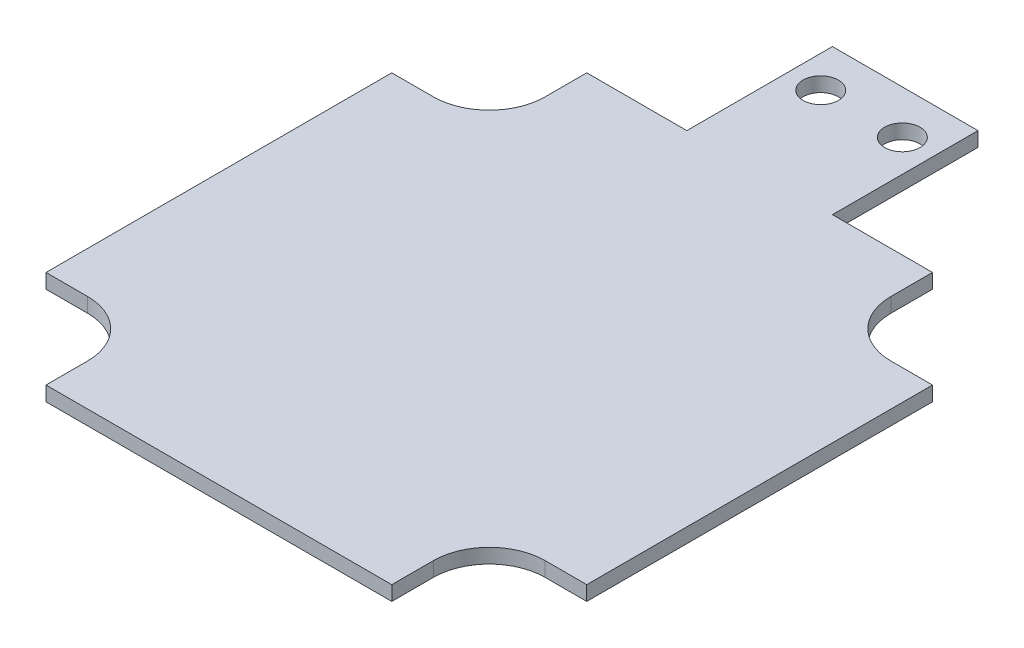
ISO-10303-21;
HEADER;
FILE_DESCRIPTION(('STEP AP214'),'2;1');
FILE_NAME('part.step','',(''),(''),'','','');
FILE_SCHEMA(('AUTOMOTIVE_DESIGN { 1 0 10303 214 1 1 1 1 }'));
ENDSEC;
DATA;
#1=APPLICATION_CONTEXT('core data for automotive mechanical design processes');
#2=APPLICATION_PROTOCOL_DEFINITION('international standard','automotive_design',2000,#1);
#3=PRODUCT_CONTEXT('',#1,'mechanical');
#4=PRODUCT('Part','Part','',(#3));
#5=PRODUCT_RELATED_PRODUCT_CATEGORY('part','',(#4));
#6=PRODUCT_DEFINITION_FORMATION('','',#4);
#7=PRODUCT_DEFINITION_CONTEXT('part definition',#1,'design');
#8=PRODUCT_DEFINITION('design','',#6,#7);
#9=PRODUCT_DEFINITION_SHAPE('','',#8);
#10=(LENGTH_UNIT() NAMED_UNIT(*) SI_UNIT(.MILLI.,.METRE.));
#11=(NAMED_UNIT(*) PLANE_ANGLE_UNIT() SI_UNIT($,.RADIAN.));
#12=(NAMED_UNIT(*) SI_UNIT($,.STERADIAN.) SOLID_ANGLE_UNIT());
#13=UNCERTAINTY_MEASURE_WITH_UNIT(LENGTH_MEASURE(1.E-05),#10,'distance_accuracy_value','');
#14=(GEOMETRIC_REPRESENTATION_CONTEXT(3) GLOBAL_UNCERTAINTY_ASSIGNED_CONTEXT((#13)) GLOBAL_UNIT_ASSIGNED_CONTEXT((#10,
#11,#12)) REPRESENTATION_CONTEXT('',''));
#15=CARTESIAN_POINT('',(0.,0.,0.));
#16=DIRECTION('',(0.,0.,1.));
#17=DIRECTION('',(1.,0.,0.));
#18=AXIS2_PLACEMENT_3D('',#15,#16,#17);
#19=CARTESIAN_POINT('',(0.,1.4,0.));
#20=DIRECTION('',(0.,-1.,0.));
#21=DIRECTION('',(0.,0.,-1.));
#22=AXIS2_PLACEMENT_3D('',#19,#20,#21);
#23=PLANE('',#22);
#24=CARTESIAN_POINT('',(-3.925,1.4,-35.8));
#25=DIRECTION('',(0.,1.,0.));
#26=DIRECTION('',(0.,0.,1.));
#27=AXIS2_PLACEMENT_3D('',#24,#25,#26);
#28=CIRCLE('',#27,1.7);
#29=CARTESIAN_POINT('',(-3.925,1.4,-34.1));
#30=VERTEX_POINT('',#29);
#31=EDGE_CURVE('E603',#30,#30,#28,.T.);
#32=ORIENTED_EDGE('',*,*,#31,.F.);
#33=EDGE_LOOP('',(#32));
#34=FACE_BOUND('',#33,.T.);
#35=CARTESIAN_POINT('',(3.925,1.4,-35.8));
#36=DIRECTION('',(0.,1.,0.));
#37=DIRECTION('',(0.,0.,1.));
#38=AXIS2_PLACEMENT_3D('',#35,#36,#37);
#39=CIRCLE('',#38,1.7);
#40=CARTESIAN_POINT('',(3.925,1.4,-34.1));
#41=VERTEX_POINT('',#40);
#42=EDGE_CURVE('E201',#41,#41,#39,.T.);
#43=ORIENTED_EDGE('',*,*,#42,.F.);
#44=EDGE_LOOP('',(#43));
#45=FACE_BOUND('',#44,.T.);
#46=CARTESIAN_POINT('',(-22.,1.4,22.));
#47=DIRECTION('',(0.,1.,0.));
#48=DIRECTION('',(0.,0.,-1.));
#49=AXIS2_PLACEMENT_3D('',#46,#47,#48);
#50=CIRCLE('',#49,5.375);
#51=CARTESIAN_POINT('',(-16.625,1.4,22.));
#52=VERTEX_POINT('',#51);
#53=CARTESIAN_POINT('',(-22.,1.4,16.625));
#54=VERTEX_POINT('',#53);
#55=EDGE_CURVE('E180',#52,#54,#50,.T.);
#56=ORIENTED_EDGE('',*,*,#55,.F.);
#57=DIRECTION('',(0.,0.,-1.));
#58=VECTOR('',#57,1.);
#59=CARTESIAN_POINT('',(-16.625,1.4,26.));
#60=LINE('',#59,#58);
#61=CARTESIAN_POINT('',(-16.625,1.4,26.));
#62=VERTEX_POINT('',#61);
#63=EDGE_CURVE('E195',#62,#52,#60,.T.);
#64=ORIENTED_EDGE('',*,*,#63,.F.);
#65=DIRECTION('',(1.,0.,0.));
#66=VECTOR('',#65,1.);
#67=CARTESIAN_POINT('',(26.,1.4,26.));
#68=LINE('',#67,#66);
#69=CARTESIAN_POINT('',(16.625,1.4,26.));
#70=VERTEX_POINT('',#69);
#71=EDGE_CURVE('E299',#62,#70,#68,.T.);
#72=ORIENTED_EDGE('',*,*,#71,.T.);
#73=DIRECTION('',(0.,0.,1.));
#74=VECTOR('',#73,1.);
#75=CARTESIAN_POINT('',(16.625,1.4,26.));
#76=LINE('',#75,#74);
#77=CARTESIAN_POINT('',(16.625,1.4,22.));
#78=VERTEX_POINT('',#77);
#79=EDGE_CURVE('E225',#78,#70,#76,.T.);
#80=ORIENTED_EDGE('',*,*,#79,.F.);
#81=CARTESIAN_POINT('',(22.,1.4,22.));
#82=DIRECTION('',(0.,1.,0.));
#83=DIRECTION('',(0.,0.,1.));
#84=AXIS2_PLACEMENT_3D('',#81,#82,#83);
#85=CIRCLE('',#84,5.375);
#86=CARTESIAN_POINT('',(22.,1.4,16.625));
#87=VERTEX_POINT('',#86);
#88=EDGE_CURVE('E210',#87,#78,#85,.T.);
#89=ORIENTED_EDGE('',*,*,#88,.F.);
#90=DIRECTION('',(-1.,0.,0.));
#91=VECTOR('',#90,1.);
#92=CARTESIAN_POINT('',(22.,1.4,16.625));
#93=LINE('',#92,#91);
#94=CARTESIAN_POINT('',(26.,1.4,16.625));
#95=VERTEX_POINT('',#94);
#96=EDGE_CURVE('E218',#95,#87,#93,.T.);
#97=ORIENTED_EDGE('',*,*,#96,.F.);
#98=DIRECTION('',(0.,0.,-1.));
#99=VECTOR('',#98,1.);
#100=CARTESIAN_POINT('',(26.,1.4,26.));
#101=LINE('',#100,#99);
#102=CARTESIAN_POINT('',(26.,1.4,-16.625));
#103=VERTEX_POINT('',#102);
#104=EDGE_CURVE('E301',#95,#103,#101,.T.);
#105=ORIENTED_EDGE('',*,*,#104,.T.);
#106=DIRECTION('',(1.,0.,0.));
#107=VECTOR('',#106,1.);
#108=CARTESIAN_POINT('',(22.,1.4,-16.625));
#109=LINE('',#108,#107);
#110=CARTESIAN_POINT('',(22.,1.4,-16.625));
#111=VERTEX_POINT('',#110);
#112=EDGE_CURVE('E252',#111,#103,#109,.T.);
#113=ORIENTED_EDGE('',*,*,#112,.F.);
#114=CARTESIAN_POINT('',(22.,1.4,-22.));
#115=DIRECTION('',(0.,1.,0.));
#116=DIRECTION('',(0.,0.,-1.));
#117=AXIS2_PLACEMENT_3D('',#114,#115,#116);
#118=CIRCLE('',#117,5.375);
#119=CARTESIAN_POINT('',(16.625,1.4,-22.));
#120=VERTEX_POINT('',#119);
#121=EDGE_CURVE('E232',#120,#111,#118,.T.);
#122=ORIENTED_EDGE('',*,*,#121,.F.);
#123=DIRECTION('',(0.,0.,1.));
#124=VECTOR('',#123,1.);
#125=CARTESIAN_POINT('',(16.625,1.4,-26.));
#126=LINE('',#125,#124);
#127=CARTESIAN_POINT('',(16.625,1.4,-26.));
#128=VERTEX_POINT('',#127);
#129=EDGE_CURVE('E243',#128,#120,#126,.T.);
#130=ORIENTED_EDGE('',*,*,#129,.F.);
#131=DIRECTION('',(-1.,0.,0.));
#132=VECTOR('',#131,1.);
#133=CARTESIAN_POINT('',(26.,1.4,-26.));
#134=LINE('',#133,#132);
#135=CARTESIAN_POINT('',(7.00000000000001,1.4,-26.));
#136=VERTEX_POINT('',#135);
#137=EDGE_CURVE('E303',#128,#136,#134,.T.);
#138=ORIENTED_EDGE('',*,*,#137,.T.);
#139=DIRECTION('',(0.,0.,-1.));
#140=VECTOR('',#139,1.);
#141=CARTESIAN_POINT('',(7.00000000000001,1.4,-26.));
#142=LINE('',#141,#140);
#143=CARTESIAN_POINT('',(7.00000000000001,1.4,-40.));
#144=VERTEX_POINT('',#143);
#145=EDGE_CURVE('E305',#136,#144,#142,.T.);
#146=ORIENTED_EDGE('',*,*,#145,.T.);
#147=DIRECTION('',(-1.,0.,0.));
#148=VECTOR('',#147,1.);
#149=CARTESIAN_POINT('',(-6.99999999999999,1.4,-40.));
#150=LINE('',#149,#148);
#151=CARTESIAN_POINT('',(-6.99999999999999,1.4,-40.));
#152=VERTEX_POINT('',#151);
#153=EDGE_CURVE('E307',#144,#152,#150,.T.);
#154=ORIENTED_EDGE('',*,*,#153,.T.);
#155=DIRECTION('',(0.,0.,1.));
#156=VECTOR('',#155,1.);
#157=CARTESIAN_POINT('',(-6.99999999999999,1.4,-26.));
#158=LINE('',#157,#156);
#159=CARTESIAN_POINT('',(-6.99999999999999,1.4,-26.));
#160=VERTEX_POINT('',#159);
#161=EDGE_CURVE('E309',#152,#160,#158,.T.);
#162=ORIENTED_EDGE('',*,*,#161,.T.);
#163=DIRECTION('',(-1.,0.,0.));
#164=VECTOR('',#163,1.);
#165=CARTESIAN_POINT('',(-6.99999999999999,1.4,-26.));
#166=LINE('',#165,#164);
#167=CARTESIAN_POINT('',(-16.625,1.4,-26.));
#168=VERTEX_POINT('',#167);
#169=EDGE_CURVE('E292',#160,#168,#166,.T.);
#170=ORIENTED_EDGE('',*,*,#169,.T.);
#171=DIRECTION('',(0.,0.,-1.));
#172=VECTOR('',#171,1.);
#173=CARTESIAN_POINT('',(-16.625,1.4,-26.));
#174=LINE('',#173,#172);
#175=CARTESIAN_POINT('',(-16.625,1.4,-22.));
#176=VERTEX_POINT('',#175);
#177=EDGE_CURVE('E270',#176,#168,#174,.T.);
#178=ORIENTED_EDGE('',*,*,#177,.F.);
#179=CARTESIAN_POINT('',(-22.,1.4,-22.));
#180=DIRECTION('',(0.,1.,0.));
#181=DIRECTION('',(0.,0.,1.));
#182=AXIS2_PLACEMENT_3D('',#179,#180,#181);
#183=CIRCLE('',#182,5.375);
#184=CARTESIAN_POINT('',(-22.,1.4,-16.625));
#185=VERTEX_POINT('',#184);
#186=EDGE_CURVE('E279',#185,#176,#183,.T.);
#187=ORIENTED_EDGE('',*,*,#186,.F.);
#188=DIRECTION('',(1.,0.,0.));
#189=VECTOR('',#188,1.);
#190=CARTESIAN_POINT('',(-22.,1.4,-16.625));
#191=LINE('',#190,#189);
#192=CARTESIAN_POINT('',(-26.,1.4,-16.625));
#193=VERTEX_POINT('',#192);
#194=EDGE_CURVE('E259',#193,#185,#191,.T.);
#195=ORIENTED_EDGE('',*,*,#194,.F.);
#196=DIRECTION('',(0.,0.,1.));
#197=VECTOR('',#196,1.);
#198=CARTESIAN_POINT('',(-26.,1.4,26.));
#199=LINE('',#198,#197);
#200=CARTESIAN_POINT('',(-26.,1.4,16.625));
#201=VERTEX_POINT('',#200);
#202=EDGE_CURVE('E295',#193,#201,#199,.T.);
#203=ORIENTED_EDGE('',*,*,#202,.T.);
#204=DIRECTION('',(-1.,0.,0.));
#205=VECTOR('',#204,1.);
#206=CARTESIAN_POINT('',(-22.,1.4,16.625));
#207=LINE('',#206,#205);
#208=EDGE_CURVE('E198',#54,#201,#207,.T.);
#209=ORIENTED_EDGE('',*,*,#208,.F.);
#210=EDGE_LOOP('',(#56,#64,#72,#80,#89,#97,#105,#113,#122,#130,#138,#146,#154,#162,#170,#178,
#187,#195,#203,#209));
#211=FACE_BOUND('',#210,.T.);
#212=ADVANCED_FACE('F37',(#34,#45,#211),#23,.F.);
#213=CARTESIAN_POINT('',(0.,0.,0.));
#214=DIRECTION('',(0.,-1.,0.));
#215=DIRECTION('',(0.,0.,-1.));
#216=AXIS2_PLACEMENT_3D('',#213,#214,#215);
#217=PLANE('',#216);
#218=CARTESIAN_POINT('',(-3.925,0.,-35.8));
#219=DIRECTION('',(0.,1.,0.));
#220=DIRECTION('',(0.,0.,1.));
#221=AXIS2_PLACEMENT_3D('',#218,#219,#220);
#222=CIRCLE('',#221,1.7);
#223=CARTESIAN_POINT('',(-3.925,0.,-34.1));
#224=VERTEX_POINT('',#223);
#225=EDGE_CURVE('E601',#224,#224,#222,.T.);
#226=ORIENTED_EDGE('',*,*,#225,.T.);
#227=EDGE_LOOP('',(#226));
#228=FACE_BOUND('',#227,.T.);
#229=CARTESIAN_POINT('',(3.925,0.,-35.8));
#230=DIRECTION('',(0.,1.,0.));
#231=DIRECTION('',(0.,0.,1.));
#232=AXIS2_PLACEMENT_3D('',#229,#230,#231);
#233=CIRCLE('',#232,1.7);
#234=CARTESIAN_POINT('',(3.925,0.,-34.1));
#235=VERTEX_POINT('',#234);
#236=EDGE_CURVE('E206',#235,#235,#233,.T.);
#237=ORIENTED_EDGE('',*,*,#236,.T.);
#238=EDGE_LOOP('',(#237));
#239=FACE_BOUND('',#238,.T.);
#240=DIRECTION('',(0.,0.,-1.));
#241=VECTOR('',#240,1.);
#242=CARTESIAN_POINT('',(-16.625,0.,26.));
#243=LINE('',#242,#241);
#244=CARTESIAN_POINT('',(-16.625,0.,26.));
#245=VERTEX_POINT('',#244);
#246=CARTESIAN_POINT('',(-16.625,0.,22.));
#247=VERTEX_POINT('',#246);
#248=EDGE_CURVE('E52',#245,#247,#243,.T.);
#249=ORIENTED_EDGE('',*,*,#248,.T.);
#250=CARTESIAN_POINT('',(-22.,0.,22.));
#251=DIRECTION('',(0.,1.,0.));
#252=DIRECTION('',(0.,0.,-1.));
#253=AXIS2_PLACEMENT_3D('',#250,#251,#252);
#254=CIRCLE('',#253,5.375);
#255=CARTESIAN_POINT('',(-22.,0.,16.625));
#256=VERTEX_POINT('',#255);
#257=EDGE_CURVE('E178',#247,#256,#254,.T.);
#258=ORIENTED_EDGE('',*,*,#257,.T.);
#259=DIRECTION('',(-1.,0.,0.));
#260=VECTOR('',#259,1.);
#261=CARTESIAN_POINT('',(-22.,0.,16.625));
#262=LINE('',#261,#260);
#263=CARTESIAN_POINT('',(-26.,0.,16.625));
#264=VERTEX_POINT('',#263);
#265=EDGE_CURVE('E186',#256,#264,#262,.T.);
#266=ORIENTED_EDGE('',*,*,#265,.T.);
#267=DIRECTION('',(0.,0.,1.));
#268=VECTOR('',#267,1.);
#269=CARTESIAN_POINT('',(-26.,0.,26.));
#270=LINE('',#269,#268);
#271=CARTESIAN_POINT('',(-26.,0.,-16.625));
#272=VERTEX_POINT('',#271);
#273=EDGE_CURVE('E314',#272,#264,#270,.T.);
#274=ORIENTED_EDGE('',*,*,#273,.F.);
#275=DIRECTION('',(1.,0.,0.));
#276=VECTOR('',#275,1.);
#277=CARTESIAN_POINT('',(-22.,0.,-16.625));
#278=LINE('',#277,#276);
#279=CARTESIAN_POINT('',(-22.,0.,-16.625));
#280=VERTEX_POINT('',#279);
#281=EDGE_CURVE('E266',#272,#280,#278,.T.);
#282=ORIENTED_EDGE('',*,*,#281,.T.);
#283=CARTESIAN_POINT('',(-22.,0.,-22.));
#284=DIRECTION('',(0.,1.,0.));
#285=DIRECTION('',(0.,0.,1.));
#286=AXIS2_PLACEMENT_3D('',#283,#284,#285);
#287=CIRCLE('',#286,5.375);
#288=CARTESIAN_POINT('',(-16.625,0.,-22.));
#289=VERTEX_POINT('',#288);
#290=EDGE_CURVE('E269',#280,#289,#287,.T.);
#291=ORIENTED_EDGE('',*,*,#290,.T.);
#292=DIRECTION('',(0.,0.,-1.));
#293=VECTOR('',#292,1.);
#294=CARTESIAN_POINT('',(-16.625,0.,-26.));
#295=LINE('',#294,#293);
#296=CARTESIAN_POINT('',(-16.625,0.,-26.));
#297=VERTEX_POINT('',#296);
#298=EDGE_CURVE('E273',#289,#297,#295,.T.);
#299=ORIENTED_EDGE('',*,*,#298,.T.);
#300=DIRECTION('',(-1.,0.,0.));
#301=VECTOR('',#300,1.);
#302=CARTESIAN_POINT('',(-6.99999999999999,0.,-26.));
#303=LINE('',#302,#301);
#304=CARTESIAN_POINT('',(-6.99999999999999,0.,-26.));
#305=VERTEX_POINT('',#304);
#306=EDGE_CURVE('E286',#305,#297,#303,.T.);
#307=ORIENTED_EDGE('',*,*,#306,.F.);
#308=DIRECTION('',(0.,0.,1.));
#309=VECTOR('',#308,1.);
#310=CARTESIAN_POINT('',(-6.99999999999999,0.,-26.));
#311=LINE('',#310,#309);
#312=CARTESIAN_POINT('',(-6.99999999999999,0.,-40.));
#313=VERTEX_POINT('',#312);
#314=EDGE_CURVE('E296',#313,#305,#311,.T.);
#315=ORIENTED_EDGE('',*,*,#314,.F.);
#316=DIRECTION('',(-1.,0.,0.));
#317=VECTOR('',#316,1.);
#318=CARTESIAN_POINT('',(-6.99999999999999,0.,-40.));
#319=LINE('',#318,#317);
#320=CARTESIAN_POINT('',(7.00000000000001,0.,-40.));
#321=VERTEX_POINT('',#320);
#322=EDGE_CURVE('E324',#321,#313,#319,.T.);
#323=ORIENTED_EDGE('',*,*,#322,.F.);
#324=DIRECTION('',(0.,0.,-1.));
#325=VECTOR('',#324,1.);
#326=CARTESIAN_POINT('',(7.00000000000001,0.,-26.));
#327=LINE('',#326,#325);
#328=CARTESIAN_POINT('',(7.00000000000001,0.,-26.));
#329=VERTEX_POINT('',#328);
#330=EDGE_CURVE('E322',#329,#321,#327,.T.);
#331=ORIENTED_EDGE('',*,*,#330,.F.);
#332=DIRECTION('',(-1.,0.,0.));
#333=VECTOR('',#332,1.);
#334=CARTESIAN_POINT('',(26.,0.,-26.));
#335=LINE('',#334,#333);
#336=CARTESIAN_POINT('',(16.625,0.,-26.));
#337=VERTEX_POINT('',#336);
#338=EDGE_CURVE('E320',#337,#329,#335,.T.);
#339=ORIENTED_EDGE('',*,*,#338,.F.);
#340=DIRECTION('',(0.,0.,1.));
#341=VECTOR('',#340,1.);
#342=CARTESIAN_POINT('',(16.625,0.,-26.));
#343=LINE('',#342,#341);
#344=CARTESIAN_POINT('',(16.625,0.,-22.));
#345=VERTEX_POINT('',#344);
#346=EDGE_CURVE('E246',#337,#345,#343,.T.);
#347=ORIENTED_EDGE('',*,*,#346,.T.);
#348=CARTESIAN_POINT('',(22.,0.,-22.));
#349=DIRECTION('',(0.,1.,0.));
#350=DIRECTION('',(0.,0.,-1.));
#351=AXIS2_PLACEMENT_3D('',#348,#349,#350);
#352=CIRCLE('',#351,5.375);
#353=CARTESIAN_POINT('',(22.,0.,-16.625));
#354=VERTEX_POINT('',#353);
#355=EDGE_CURVE('E239',#345,#354,#352,.T.);
#356=ORIENTED_EDGE('',*,*,#355,.T.);
#357=DIRECTION('',(1.,0.,0.));
#358=VECTOR('',#357,1.);
#359=CARTESIAN_POINT('',(22.,0.,-16.625));
#360=LINE('',#359,#358);
#361=CARTESIAN_POINT('',(26.,0.,-16.625));
#362=VERTEX_POINT('',#361);
#363=EDGE_CURVE('E242',#354,#362,#360,.T.);
#364=ORIENTED_EDGE('',*,*,#363,.T.);
#365=DIRECTION('',(0.,0.,-1.));
#366=VECTOR('',#365,1.);
#367=CARTESIAN_POINT('',(26.,0.,26.));
#368=LINE('',#367,#366);
#369=CARTESIAN_POINT('',(26.,0.,16.625));
#370=VERTEX_POINT('',#369);
#371=EDGE_CURVE('E318',#370,#362,#368,.T.);
#372=ORIENTED_EDGE('',*,*,#371,.F.);
#373=DIRECTION('',(-1.,0.,0.));
#374=VECTOR('',#373,1.);
#375=CARTESIAN_POINT('',(22.,0.,16.625));
#376=LINE('',#375,#374);
#377=CARTESIAN_POINT('',(22.,0.,16.625));
#378=VERTEX_POINT('',#377);
#379=EDGE_CURVE('E60',#370,#378,#376,.T.);
#380=ORIENTED_EDGE('',*,*,#379,.T.);
#381=CARTESIAN_POINT('',(22.,0.,22.));
#382=DIRECTION('',(0.,1.,0.));
#383=DIRECTION('',(0.,0.,1.));
#384=AXIS2_PLACEMENT_3D('',#381,#382,#383);
#385=CIRCLE('',#384,5.375);
#386=CARTESIAN_POINT('',(16.625,0.,22.));
#387=VERTEX_POINT('',#386);
#388=EDGE_CURVE('E214',#378,#387,#385,.T.);
#389=ORIENTED_EDGE('',*,*,#388,.T.);
#390=DIRECTION('',(0.,0.,1.));
#391=VECTOR('',#390,1.);
#392=CARTESIAN_POINT('',(16.625,0.,26.));
#393=LINE('',#392,#391);
#394=CARTESIAN_POINT('',(16.625,0.,26.));
#395=VERTEX_POINT('',#394);
#396=EDGE_CURVE('E217',#387,#395,#393,.T.);
#397=ORIENTED_EDGE('',*,*,#396,.T.);
#398=DIRECTION('',(1.,0.,0.));
#399=VECTOR('',#398,1.);
#400=CARTESIAN_POINT('',(26.,0.,26.));
#401=LINE('',#400,#399);
#402=EDGE_CURVE('E316',#245,#395,#401,.T.);
#403=ORIENTED_EDGE('',*,*,#402,.F.);
#404=EDGE_LOOP('',(#249,#258,#266,#274,#282,#291,#299,#307,#315,#323,#331,#339,#347,#356,#364,
#372,#380,#389,#397,#403));
#405=FACE_BOUND('',#404,.T.);
#406=ADVANCED_FACE('F193',(#228,#239,#405),#217,.T.);
#407=CARTESIAN_POINT('',(-6.99999999999999,1.4,-26.));
#408=DIRECTION('',(0.,0.,1.));
#409=DIRECTION('',(1.,0.,0.));
#410=AXIS2_PLACEMENT_3D('',#407,#408,#409);
#411=PLANE('',#410);
#412=ORIENTED_EDGE('',*,*,#306,.T.);
#413=DIRECTION('',(0.,1.,0.));
#414=VECTOR('',#413,1.);
#415=CARTESIAN_POINT('',(-16.625,0.,-26.));
#416=LINE('',#415,#414);
#417=EDGE_CURVE('E283',#297,#168,#416,.T.);
#418=ORIENTED_EDGE('',*,*,#417,.T.);
#419=ORIENTED_EDGE('',*,*,#169,.F.);
#420=DIRECTION('',(0.,-1.,0.));
#421=VECTOR('',#420,1.);
#422=CARTESIAN_POINT('',(-6.99999999999999,1.4,-26.));
#423=LINE('',#422,#421);
#424=EDGE_CURVE('E311',#160,#305,#423,.T.);
#425=ORIENTED_EDGE('',*,*,#424,.T.);
#426=EDGE_LOOP('',(#412,#418,#419,#425));
#427=FACE_BOUND('',#426,.T.);
#428=ADVANCED_FACE('F39',(#427),#411,.F.);
#429=CARTESIAN_POINT('',(-26.,1.4,26.));
#430=DIRECTION('',(1.,0.,0.));
#431=DIRECTION('',(0.,0.,-1.));
#432=AXIS2_PLACEMENT_3D('',#429,#430,#431);
#433=PLANE('',#432);
#434=ORIENTED_EDGE('',*,*,#273,.T.);
#435=DIRECTION('',(0.,1.,0.));
#436=VECTOR('',#435,1.);
#437=CARTESIAN_POINT('',(-26.,0.,16.625));
#438=LINE('',#437,#436);
#439=EDGE_CURVE('E183',#264,#201,#438,.T.);
#440=ORIENTED_EDGE('',*,*,#439,.T.);
#441=ORIENTED_EDGE('',*,*,#202,.F.);
#442=DIRECTION('',(0.,1.,0.));
#443=VECTOR('',#442,1.);
#444=CARTESIAN_POINT('',(-26.,0.,-16.625));
#445=LINE('',#444,#443);
#446=EDGE_CURVE('E276',#272,#193,#445,.T.);
#447=ORIENTED_EDGE('',*,*,#446,.F.);
#448=EDGE_LOOP('',(#434,#440,#441,#447));
#449=FACE_BOUND('',#448,.T.);
#450=ADVANCED_FACE('F394',(#449),#433,.F.);
#451=CARTESIAN_POINT('',(26.,1.4,26.));
#452=DIRECTION('',(0.,0.,-1.));
#453=DIRECTION('',(-1.,0.,0.));
#454=AXIS2_PLACEMENT_3D('',#451,#452,#453);
#455=PLANE('',#454);
#456=ORIENTED_EDGE('',*,*,#71,.F.);
#457=DIRECTION('',(0.,1.,0.));
#458=VECTOR('',#457,1.);
#459=CARTESIAN_POINT('',(-16.625,0.,26.));
#460=LINE('',#459,#458);
#461=EDGE_CURVE('E211',#245,#62,#460,.T.);
#462=ORIENTED_EDGE('',*,*,#461,.F.);
#463=ORIENTED_EDGE('',*,*,#402,.T.);
#464=DIRECTION('',(0.,1.,0.));
#465=VECTOR('',#464,1.);
#466=CARTESIAN_POINT('',(16.625,0.,26.));
#467=LINE('',#466,#465);
#468=EDGE_CURVE('E235',#395,#70,#467,.T.);
#469=ORIENTED_EDGE('',*,*,#468,.T.);
#470=EDGE_LOOP('',(#456,#462,#463,#469));
#471=FACE_BOUND('',#470,.T.);
#472=ADVANCED_FACE('F388',(#471),#455,.F.);
#473=CARTESIAN_POINT('',(26.,1.4,26.));
#474=DIRECTION('',(-1.,0.,0.));
#475=DIRECTION('',(0.,0.,1.));
#476=AXIS2_PLACEMENT_3D('',#473,#474,#475);
#477=PLANE('',#476);
#478=ORIENTED_EDGE('',*,*,#104,.F.);
#479=DIRECTION('',(0.,1.,0.));
#480=VECTOR('',#479,1.);
#481=CARTESIAN_POINT('',(26.,0.,16.625));
#482=LINE('',#481,#480);
#483=EDGE_CURVE('E233',#370,#95,#482,.T.);
#484=ORIENTED_EDGE('',*,*,#483,.F.);
#485=ORIENTED_EDGE('',*,*,#371,.T.);
#486=DIRECTION('',(0.,1.,0.));
#487=VECTOR('',#486,1.);
#488=CARTESIAN_POINT('',(26.,0.,-16.625));
#489=LINE('',#488,#487);
#490=EDGE_CURVE('E262',#362,#103,#489,.T.);
#491=ORIENTED_EDGE('',*,*,#490,.T.);
#492=EDGE_LOOP('',(#478,#484,#485,#491));
#493=FACE_BOUND('',#492,.T.);
#494=ADVANCED_FACE('F374',(#493),#477,.F.);
#495=CARTESIAN_POINT('',(26.,1.4,-26.));
#496=DIRECTION('',(0.,0.,1.));
#497=DIRECTION('',(1.,0.,0.));
#498=AXIS2_PLACEMENT_3D('',#495,#496,#497);
#499=PLANE('',#498);
#500=ORIENTED_EDGE('',*,*,#137,.F.);
#501=DIRECTION('',(0.,1.,0.));
#502=VECTOR('',#501,1.);
#503=CARTESIAN_POINT('',(16.625,0.,-26.));
#504=LINE('',#503,#502);
#505=EDGE_CURVE('E260',#337,#128,#504,.T.);
#506=ORIENTED_EDGE('',*,*,#505,.F.);
#507=ORIENTED_EDGE('',*,*,#338,.T.);
#508=DIRECTION('',(0.,-1.,0.));
#509=VECTOR('',#508,1.);
#510=CARTESIAN_POINT('',(7.00000000000001,1.4,-26.));
#511=LINE('',#510,#509);
#512=EDGE_CURVE('E11',#136,#329,#511,.T.);
#513=ORIENTED_EDGE('',*,*,#512,.F.);
#514=EDGE_LOOP('',(#500,#506,#507,#513));
#515=FACE_BOUND('',#514,.T.);
#516=ADVANCED_FACE('F358',(#515),#499,.F.);
#517=CARTESIAN_POINT('',(7.00000000000001,1.4,-26.));
#518=DIRECTION('',(-1.,0.,0.));
#519=DIRECTION('',(0.,0.,1.));
#520=AXIS2_PLACEMENT_3D('',#517,#518,#519);
#521=PLANE('',#520);
#522=ORIENTED_EDGE('',*,*,#330,.T.);
#523=DIRECTION('',(0.,-1.,0.));
#524=VECTOR('',#523,1.);
#525=CARTESIAN_POINT('',(7.00000000000001,1.4,-40.));
#526=LINE('',#525,#524);
#527=EDGE_CURVE('E45',#144,#321,#526,.T.);
#528=ORIENTED_EDGE('',*,*,#527,.F.);
#529=ORIENTED_EDGE('',*,*,#145,.F.);
#530=ORIENTED_EDGE('',*,*,#512,.T.);
#531=EDGE_LOOP('',(#522,#528,#529,#530));
#532=FACE_BOUND('',#531,.T.);
#533=ADVANCED_FACE('F356',(#532),#521,.F.);
#534=CARTESIAN_POINT('',(-6.99999999999999,1.4,-40.));
#535=DIRECTION('',(0.,0.,1.));
#536=DIRECTION('',(1.,0.,0.));
#537=AXIS2_PLACEMENT_3D('',#534,#535,#536);
#538=PLANE('',#537);
#539=ORIENTED_EDGE('',*,*,#322,.T.);
#540=DIRECTION('',(0.,-1.,0.));
#541=VECTOR('',#540,1.);
#542=CARTESIAN_POINT('',(-6.99999999999999,1.4,-40.));
#543=LINE('',#542,#541);
#544=EDGE_CURVE('E329',#152,#313,#543,.T.);
#545=ORIENTED_EDGE('',*,*,#544,.F.);
#546=ORIENTED_EDGE('',*,*,#153,.F.);
#547=ORIENTED_EDGE('',*,*,#527,.T.);
#548=EDGE_LOOP('',(#539,#545,#546,#547));
#549=FACE_BOUND('',#548,.T.);
#550=ADVANCED_FACE('F336',(#549),#538,.F.);
#551=CARTESIAN_POINT('',(-6.99999999999999,1.4,-26.));
#552=DIRECTION('',(1.,0.,0.));
#553=DIRECTION('',(0.,0.,-1.));
#554=AXIS2_PLACEMENT_3D('',#551,#552,#553);
#555=PLANE('',#554);
#556=ORIENTED_EDGE('',*,*,#314,.T.);
#557=ORIENTED_EDGE('',*,*,#424,.F.);
#558=ORIENTED_EDGE('',*,*,#161,.F.);
#559=ORIENTED_EDGE('',*,*,#544,.T.);
#560=EDGE_LOOP('',(#556,#557,#558,#559));
#561=FACE_BOUND('',#560,.T.);
#562=ADVANCED_FACE('F346',(#561),#555,.F.);
#563=CARTESIAN_POINT('',(-16.625,0.,-26.));
#564=DIRECTION('',(1.,0.,0.));
#565=DIRECTION('',(0.,0.,-1.));
#566=AXIS2_PLACEMENT_3D('',#563,#564,#565);
#567=PLANE('',#566);
#568=ORIENTED_EDGE('',*,*,#177,.T.);
#569=ORIENTED_EDGE('',*,*,#417,.F.);
#570=ORIENTED_EDGE('',*,*,#298,.F.);
#571=DIRECTION('',(0.,1.,0.));
#572=VECTOR('',#571,1.);
#573=CARTESIAN_POINT('',(-16.625,0.,-22.));
#574=LINE('',#573,#572);
#575=EDGE_CURVE('E287',#289,#176,#574,.T.);
#576=ORIENTED_EDGE('',*,*,#575,.T.);
#577=EDGE_LOOP('',(#568,#569,#570,#576));
#578=FACE_BOUND('',#577,.T.);
#579=ADVANCED_FACE('F403',(#578),#567,.F.);
#580=CARTESIAN_POINT('',(-22.,0.,-22.));
#581=DIRECTION('',(0.,1.,0.));
#582=DIRECTION('',(0.,0.,1.));
#583=AXIS2_PLACEMENT_3D('',#580,#581,#582);
#584=CYLINDRICAL_SURFACE('',#583,5.375);
#585=ORIENTED_EDGE('',*,*,#186,.T.);
#586=ORIENTED_EDGE('',*,*,#575,.F.);
#587=ORIENTED_EDGE('',*,*,#290,.F.);
#588=DIRECTION('',(0.,1.,0.));
#589=VECTOR('',#588,1.);
#590=CARTESIAN_POINT('',(-22.,0.,-16.625));
#591=LINE('',#590,#589);
#592=EDGE_CURVE('E289',#280,#185,#591,.T.);
#593=ORIENTED_EDGE('',*,*,#592,.T.);
#594=EDGE_LOOP('',(#585,#586,#587,#593));
#595=FACE_BOUND('',#594,.T.);
#596=ADVANCED_FACE('F400',(#595),#584,.F.);
#597=CARTESIAN_POINT('',(-22.,0.,-16.625));
#598=DIRECTION('',(0.,0.,1.));
#599=DIRECTION('',(1.,0.,0.));
#600=AXIS2_PLACEMENT_3D('',#597,#598,#599);
#601=PLANE('',#600);
#602=ORIENTED_EDGE('',*,*,#194,.T.);
#603=ORIENTED_EDGE('',*,*,#592,.F.);
#604=ORIENTED_EDGE('',*,*,#281,.F.);
#605=ORIENTED_EDGE('',*,*,#446,.T.);
#606=EDGE_LOOP('',(#602,#603,#604,#605));
#607=FACE_BOUND('',#606,.T.);
#608=ADVANCED_FACE('F398',(#607),#601,.F.);
#609=CARTESIAN_POINT('',(22.,0.,-22.));
#610=DIRECTION('',(0.,1.,0.));
#611=DIRECTION('',(0.,0.,1.));
#612=AXIS2_PLACEMENT_3D('',#609,#610,#611);
#613=CYLINDRICAL_SURFACE('',#612,5.375);
#614=ORIENTED_EDGE('',*,*,#121,.T.);
#615=DIRECTION('',(0.,1.,0.));
#616=VECTOR('',#615,1.);
#617=CARTESIAN_POINT('',(22.,0.,-16.625));
#618=LINE('',#617,#616);
#619=EDGE_CURVE('E249',#354,#111,#618,.T.);
#620=ORIENTED_EDGE('',*,*,#619,.F.);
#621=ORIENTED_EDGE('',*,*,#355,.F.);
#622=DIRECTION('',(0.,1.,0.));
#623=VECTOR('',#622,1.);
#624=CARTESIAN_POINT('',(16.625,0.,-22.));
#625=LINE('',#624,#623);
#626=EDGE_CURVE('E257',#345,#120,#625,.T.);
#627=ORIENTED_EDGE('',*,*,#626,.T.);
#628=EDGE_LOOP('',(#614,#620,#621,#627));
#629=FACE_BOUND('',#628,.T.);
#630=ADVANCED_FACE('F365',(#629),#613,.F.);
#631=CARTESIAN_POINT('',(16.625,0.,-26.));
#632=DIRECTION('',(-1.,0.,0.));
#633=DIRECTION('',(0.,0.,1.));
#634=AXIS2_PLACEMENT_3D('',#631,#632,#633);
#635=PLANE('',#634);
#636=ORIENTED_EDGE('',*,*,#129,.T.);
#637=ORIENTED_EDGE('',*,*,#626,.F.);
#638=ORIENTED_EDGE('',*,*,#346,.F.);
#639=ORIENTED_EDGE('',*,*,#505,.T.);
#640=EDGE_LOOP('',(#636,#637,#638,#639));
#641=FACE_BOUND('',#640,.T.);
#642=ADVANCED_FACE('F362',(#641),#635,.F.);
#643=CARTESIAN_POINT('',(22.,0.,-16.625));
#644=DIRECTION('',(0.,0.,1.));
#645=DIRECTION('',(1.,0.,0.));
#646=AXIS2_PLACEMENT_3D('',#643,#644,#645);
#647=PLANE('',#646);
#648=ORIENTED_EDGE('',*,*,#112,.T.);
#649=ORIENTED_EDGE('',*,*,#490,.F.);
#650=ORIENTED_EDGE('',*,*,#363,.F.);
#651=ORIENTED_EDGE('',*,*,#619,.T.);
#652=EDGE_LOOP('',(#648,#649,#650,#651));
#653=FACE_BOUND('',#652,.T.);
#654=ADVANCED_FACE('F370',(#653),#647,.F.);
#655=CARTESIAN_POINT('',(22.,0.,22.));
#656=DIRECTION('',(0.,1.,0.));
#657=DIRECTION('',(0.,0.,1.));
#658=AXIS2_PLACEMENT_3D('',#655,#656,#657);
#659=CYLINDRICAL_SURFACE('',#658,5.375);
#660=ORIENTED_EDGE('',*,*,#88,.T.);
#661=DIRECTION('',(0.,1.,0.));
#662=VECTOR('',#661,1.);
#663=CARTESIAN_POINT('',(16.625,0.,22.));
#664=LINE('',#663,#662);
#665=EDGE_CURVE('E222',#387,#78,#664,.T.);
#666=ORIENTED_EDGE('',*,*,#665,.F.);
#667=ORIENTED_EDGE('',*,*,#388,.F.);
#668=DIRECTION('',(0.,1.,0.));
#669=VECTOR('',#668,1.);
#670=CARTESIAN_POINT('',(22.,0.,16.625));
#671=LINE('',#670,#669);
#672=EDGE_CURVE('E230',#378,#87,#671,.T.);
#673=ORIENTED_EDGE('',*,*,#672,.T.);
#674=EDGE_LOOP('',(#660,#666,#667,#673));
#675=FACE_BOUND('',#674,.T.);
#676=ADVANCED_FACE('F380',(#675),#659,.F.);
#677=CARTESIAN_POINT('',(22.,0.,16.625));
#678=DIRECTION('',(0.,0.,-1.));
#679=DIRECTION('',(-1.,0.,0.));
#680=AXIS2_PLACEMENT_3D('',#677,#678,#679);
#681=PLANE('',#680);
#682=ORIENTED_EDGE('',*,*,#96,.T.);
#683=ORIENTED_EDGE('',*,*,#672,.F.);
#684=ORIENTED_EDGE('',*,*,#379,.F.);
#685=ORIENTED_EDGE('',*,*,#483,.T.);
#686=EDGE_LOOP('',(#682,#683,#684,#685));
#687=FACE_BOUND('',#686,.T.);
#688=ADVANCED_FACE('F376',(#687),#681,.F.);
#689=CARTESIAN_POINT('',(16.625,0.,26.));
#690=DIRECTION('',(-1.,0.,0.));
#691=DIRECTION('',(0.,0.,1.));
#692=AXIS2_PLACEMENT_3D('',#689,#690,#691);
#693=PLANE('',#692);
#694=ORIENTED_EDGE('',*,*,#79,.T.);
#695=ORIENTED_EDGE('',*,*,#468,.F.);
#696=ORIENTED_EDGE('',*,*,#396,.F.);
#697=ORIENTED_EDGE('',*,*,#665,.T.);
#698=EDGE_LOOP('',(#694,#695,#696,#697));
#699=FACE_BOUND('',#698,.T.);
#700=ADVANCED_FACE('F385',(#699),#693,.F.);
#701=CARTESIAN_POINT('',(-22.,0.,22.));
#702=DIRECTION('',(0.,1.,0.));
#703=DIRECTION('',(0.,0.,1.));
#704=AXIS2_PLACEMENT_3D('',#701,#702,#703);
#705=CYLINDRICAL_SURFACE('',#704,5.375);
#706=ORIENTED_EDGE('',*,*,#55,.T.);
#707=DIRECTION('',(0.,1.,0.));
#708=VECTOR('',#707,1.);
#709=CARTESIAN_POINT('',(-22.,0.,16.625));
#710=LINE('',#709,#708);
#711=EDGE_CURVE('E174',#256,#54,#710,.T.);
#712=ORIENTED_EDGE('',*,*,#711,.F.);
#713=ORIENTED_EDGE('',*,*,#257,.F.);
#714=DIRECTION('',(0.,1.,0.));
#715=VECTOR('',#714,1.);
#716=CARTESIAN_POINT('',(-16.625,0.,22.));
#717=LINE('',#716,#715);
#718=EDGE_CURVE('E208',#247,#52,#717,.T.);
#719=ORIENTED_EDGE('',*,*,#718,.T.);
#720=EDGE_LOOP('',(#706,#712,#713,#719));
#721=FACE_BOUND('',#720,.T.);
#722=ADVANCED_FACE('F176',(#721),#705,.F.);
#723=CARTESIAN_POINT('',(-16.625,0.,26.));
#724=DIRECTION('',(1.,0.,0.));
#725=DIRECTION('',(0.,0.,-1.));
#726=AXIS2_PLACEMENT_3D('',#723,#724,#725);
#727=PLANE('',#726);
#728=ORIENTED_EDGE('',*,*,#63,.T.);
#729=ORIENTED_EDGE('',*,*,#718,.F.);
#730=ORIENTED_EDGE('',*,*,#248,.F.);
#731=ORIENTED_EDGE('',*,*,#461,.T.);
#732=EDGE_LOOP('',(#728,#729,#730,#731));
#733=FACE_BOUND('',#732,.T.);
#734=ADVANCED_FACE('F390',(#733),#727,.F.);
#735=CARTESIAN_POINT('',(-22.,0.,16.625));
#736=DIRECTION('',(0.,0.,-1.));
#737=DIRECTION('',(-1.,0.,0.));
#738=AXIS2_PLACEMENT_3D('',#735,#736,#737);
#739=PLANE('',#738);
#740=ORIENTED_EDGE('',*,*,#208,.T.);
#741=ORIENTED_EDGE('',*,*,#439,.F.);
#742=ORIENTED_EDGE('',*,*,#265,.F.);
#743=ORIENTED_EDGE('',*,*,#711,.T.);
#744=EDGE_LOOP('',(#740,#741,#742,#743));
#745=FACE_BOUND('',#744,.T.);
#746=ADVANCED_FACE('F187',(#745),#739,.F.);
#747=CARTESIAN_POINT('',(3.925,0.,-35.8));
#748=DIRECTION('',(0.,1.,0.));
#749=DIRECTION('',(0.,0.,1.));
#750=AXIS2_PLACEMENT_3D('',#747,#748,#749);
#751=CYLINDRICAL_SURFACE('',#750,1.7);
#752=ORIENTED_EDGE('',*,*,#236,.F.);
#753=EDGE_LOOP('',(#752));
#754=FACE_BOUND('',#753,.T.);
#755=ORIENTED_EDGE('',*,*,#42,.T.);
#756=EDGE_LOOP('',(#755));
#757=FACE_BOUND('',#756,.T.);
#758=ADVANCED_FACE('F462',(#754,#757),#751,.F.);
#759=CARTESIAN_POINT('',(-3.925,0.,-35.8));
#760=DIRECTION('',(0.,1.,0.));
#761=DIRECTION('',(0.,0.,1.));
#762=AXIS2_PLACEMENT_3D('',#759,#760,#761);
#763=CYLINDRICAL_SURFACE('',#762,1.7);
#764=ORIENTED_EDGE('',*,*,#225,.F.);
#765=EDGE_LOOP('',(#764));
#766=FACE_BOUND('',#765,.T.);
#767=ORIENTED_EDGE('',*,*,#31,.T.);
#768=EDGE_LOOP('',(#767));
#769=FACE_BOUND('',#768,.T.);
#770=ADVANCED_FACE('F592',(#766,#769),#763,.F.);
#771=CLOSED_SHELL('',(#212,#406,#428,#450,#472,#494,#516,#533,#550,#562,#579,#596,#608,#630,
#642,#654,#676,#688,#700,#722,#734,#746,#758,#770));
#772=MANIFOLD_SOLID_BREP('B2',#771);
#773=ADVANCED_BREP_SHAPE_REPRESENTATION('',(#18,#772),#14);
#774=SHAPE_DEFINITION_REPRESENTATION(#9,#773);
ENDSEC;
END-ISO-10303-21;
